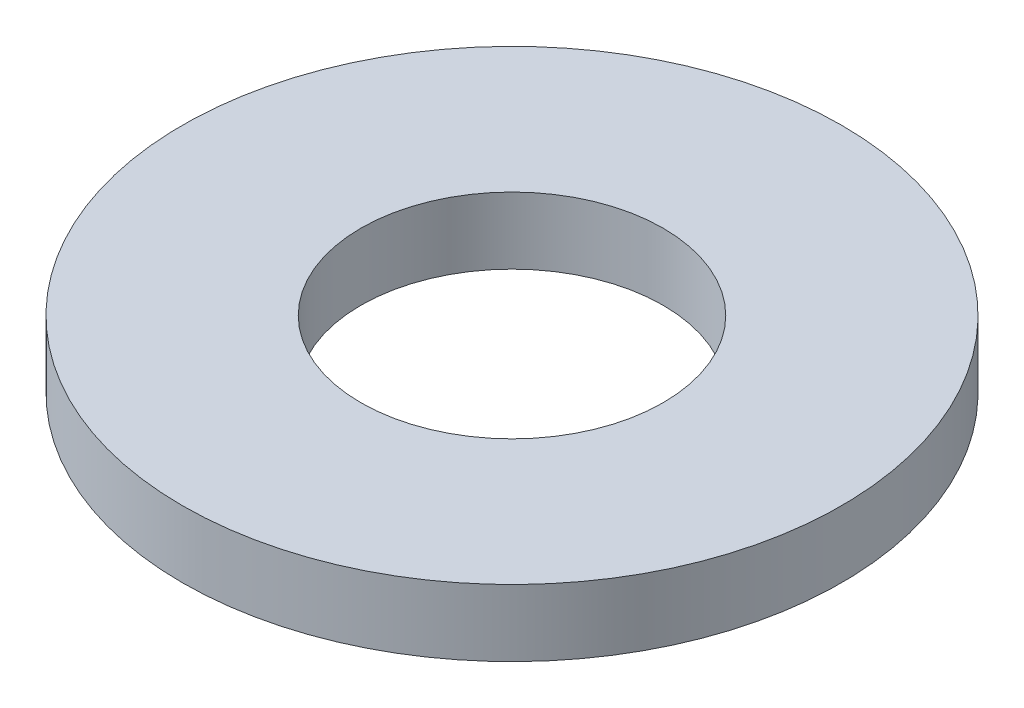
ISO-10303-21;
HEADER;
FILE_DESCRIPTION(('STEP AP214'),'2;1');
FILE_NAME('part.step','',(''),(''),'','','');
FILE_SCHEMA(('AUTOMOTIVE_DESIGN { 1 0 10303 214 1 1 1 1 }'));
ENDSEC;
DATA;
#1=APPLICATION_CONTEXT('core data for automotive mechanical design processes');
#2=APPLICATION_PROTOCOL_DEFINITION('international standard','automotive_design',2000,#1);
#3=PRODUCT_CONTEXT('',#1,'mechanical');
#4=PRODUCT('Part','Part','',(#3));
#5=PRODUCT_RELATED_PRODUCT_CATEGORY('part','',(#4));
#6=PRODUCT_DEFINITION_FORMATION('','',#4);
#7=PRODUCT_DEFINITION_CONTEXT('part definition',#1,'design');
#8=PRODUCT_DEFINITION('design','',#6,#7);
#9=PRODUCT_DEFINITION_SHAPE('','',#8);
#10=(LENGTH_UNIT() NAMED_UNIT(*) SI_UNIT(.MILLI.,.METRE.));
#11=(NAMED_UNIT(*) PLANE_ANGLE_UNIT() SI_UNIT($,.RADIAN.));
#12=(NAMED_UNIT(*) SI_UNIT($,.STERADIAN.) SOLID_ANGLE_UNIT());
#13=UNCERTAINTY_MEASURE_WITH_UNIT(LENGTH_MEASURE(1.E-05),#10,'distance_accuracy_value','');
#14=(GEOMETRIC_REPRESENTATION_CONTEXT(3) GLOBAL_UNCERTAINTY_ASSIGNED_CONTEXT((#13)) GLOBAL_UNIT_ASSIGNED_CONTEXT((#10,
#11,#12)) REPRESENTATION_CONTEXT('',''));
#15=CARTESIAN_POINT('',(0.,0.,0.));
#16=DIRECTION('',(0.,0.,1.));
#17=DIRECTION('',(1.,0.,0.));
#18=AXIS2_PLACEMENT_3D('',#15,#16,#17);
#19=CARTESIAN_POINT('',(0.,0.9652,0.));
#20=DIRECTION('',(0.,-1.,0.));
#21=DIRECTION('',(0.,0.,-1.));
#22=AXIS2_PLACEMENT_3D('',#19,#20,#21);
#23=CYLINDRICAL_SURFACE('',#22,4.7625);
#24=CARTESIAN_POINT('',(0.,0.9652,0.));
#25=DIRECTION('',(0.,1.,0.));
#26=DIRECTION('',(0.,0.,1.));
#27=AXIS2_PLACEMENT_3D('',#24,#25,#26);
#28=CIRCLE('',#27,4.7625);
#29=CARTESIAN_POINT('',(0.,0.9652,-4.7625));
#30=VERTEX_POINT('',#29);
#31=EDGE_CURVE('E10',#30,#30,#28,.T.);
#32=CARTESIAN_POINT('',(0.,0.,0.));
#33=DIRECTION('',(0.,1.,0.));
#34=DIRECTION('',(0.,0.,1.));
#35=AXIS2_PLACEMENT_3D('',#32,#33,#34);
#36=CIRCLE('',#35,4.7625);
#37=CARTESIAN_POINT('',(0.,0.,-4.7625));
#38=VERTEX_POINT('',#37);
#39=EDGE_CURVE('E33',#38,#38,#36,.T.);
#40=CARTESIAN_POINT('',(0.,0.9652,-4.7625));
#41=CARTESIAN_POINT('',(0.,0.955145833333333,-4.7625));
#42=CARTESIAN_POINT('',(0.,0.945091666666667,-4.7625));
#43=CARTESIAN_POINT('',(0.,0.924983333333333,-4.7625));
#44=CARTESIAN_POINT('',(0.,0.914929166666667,-4.7625));
#45=CARTESIAN_POINT('',(0.,0.894820833333333,-4.7625));
#46=CARTESIAN_POINT('',(0.,0.884766666666667,-4.7625));
#47=CARTESIAN_POINT('',(0.,0.864658333333333,-4.7625));
#48=CARTESIAN_POINT('',(0.,0.854604166666667,-4.7625));
#49=CARTESIAN_POINT('',(0.,0.834495833333333,-4.7625));
#50=CARTESIAN_POINT('',(0.,0.824441666666667,-4.7625));
#51=CARTESIAN_POINT('',(0.,0.804333333333333,-4.7625));
#52=CARTESIAN_POINT('',(0.,0.794279166666667,-4.7625));
#53=CARTESIAN_POINT('',(0.,0.774170833333333,-4.7625));
#54=CARTESIAN_POINT('',(0.,0.764116666666667,-4.7625));
#55=CARTESIAN_POINT('',(0.,0.744008333333333,-4.7625));
#56=CARTESIAN_POINT('',(0.,0.733954166666667,-4.7625));
#57=CARTESIAN_POINT('',(0.,0.713845833333333,-4.7625));
#58=CARTESIAN_POINT('',(0.,0.703791666666667,-4.7625));
#59=CARTESIAN_POINT('',(0.,0.683683333333333,-4.7625));
#60=CARTESIAN_POINT('',(0.,0.673629166666667,-4.7625));
#61=CARTESIAN_POINT('',(0.,0.653520833333333,-4.7625));
#62=CARTESIAN_POINT('',(0.,0.643466666666667,-4.7625));
#63=CARTESIAN_POINT('',(0.,0.623358333333333,-4.7625));
#64=CARTESIAN_POINT('',(0.,0.613304166666667,-4.7625));
#65=CARTESIAN_POINT('',(0.,0.593195833333333,-4.7625));
#66=CARTESIAN_POINT('',(0.,0.583141666666667,-4.7625));
#67=CARTESIAN_POINT('',(0.,0.563033333333333,-4.7625));
#68=CARTESIAN_POINT('',(0.,0.552979166666667,-4.7625));
#69=CARTESIAN_POINT('',(0.,0.532870833333333,-4.7625));
#70=CARTESIAN_POINT('',(0.,0.522816666666667,-4.7625));
#71=CARTESIAN_POINT('',(0.,0.502708333333333,-4.7625));
#72=CARTESIAN_POINT('',(0.,0.492654166666667,-4.7625));
#73=CARTESIAN_POINT('',(0.,0.472545833333333,-4.7625));
#74=CARTESIAN_POINT('',(0.,0.462491666666667,-4.7625));
#75=CARTESIAN_POINT('',(0.,0.442383333333333,-4.7625));
#76=CARTESIAN_POINT('',(0.,0.432329166666667,-4.7625));
#77=CARTESIAN_POINT('',(0.,0.412220833333333,-4.7625));
#78=CARTESIAN_POINT('',(0.,0.402166666666667,-4.7625));
#79=CARTESIAN_POINT('',(0.,0.382058333333333,-4.7625));
#80=CARTESIAN_POINT('',(0.,0.372004166666667,-4.7625));
#81=CARTESIAN_POINT('',(0.,0.351895833333333,-4.7625));
#82=CARTESIAN_POINT('',(0.,0.341841666666667,-4.7625));
#83=CARTESIAN_POINT('',(0.,0.321733333333333,-4.7625));
#84=CARTESIAN_POINT('',(0.,0.311679166666667,-4.7625));
#85=CARTESIAN_POINT('',(0.,0.291570833333333,-4.7625));
#86=CARTESIAN_POINT('',(0.,0.281516666666667,-4.7625));
#87=CARTESIAN_POINT('',(0.,0.261408333333333,-4.7625));
#88=CARTESIAN_POINT('',(0.,0.251354166666667,-4.7625));
#89=CARTESIAN_POINT('',(0.,0.231245833333333,-4.7625));
#90=CARTESIAN_POINT('',(0.,0.221191666666667,-4.7625));
#91=CARTESIAN_POINT('',(0.,0.201083333333333,-4.7625));
#92=CARTESIAN_POINT('',(0.,0.191029166666667,-4.7625));
#93=CARTESIAN_POINT('',(0.,0.170920833333333,-4.7625));
#94=CARTESIAN_POINT('',(0.,0.160866666666667,-4.7625));
#95=CARTESIAN_POINT('',(0.,0.140758333333333,-4.7625));
#96=CARTESIAN_POINT('',(0.,0.130704166666667,-4.7625));
#97=CARTESIAN_POINT('',(0.,0.110595833333333,-4.7625));
#98=CARTESIAN_POINT('',(0.,0.100541666666667,-4.7625));
#99=CARTESIAN_POINT('',(0.,0.0804333333333333,-4.7625));
#100=CARTESIAN_POINT('',(0.,0.0703791666666666,-4.7625));
#101=CARTESIAN_POINT('',(0.,0.0502708333333333,-4.7625));
#102=CARTESIAN_POINT('',(0.,0.0402166666666666,-4.7625));
#103=CARTESIAN_POINT('',(0.,0.0201083333333333,-4.7625));
#104=CARTESIAN_POINT('',(0.,0.0100541666666667,-4.7625));
#105=CARTESIAN_POINT('',(0.,0.,-4.7625));
#106=B_SPLINE_CURVE_WITH_KNOTS('',3,(#40,#41,#42,#43,#44,#45,#46,#47,#48,#49,#50,#51,#52,#53,
#54,#55,#56,#57,#58,#59,#60,#61,#62,#63,#64,#65,#66,#67,#68,#69,#70,#71,#72,#73,#74,#75,#76,#77,
#78,#79,#80,#81,#82,#83,#84,#85,#86,#87,#88,#89,#90,#91,#92,#93,#94,#95,#96,#97,#98,#99,#100,
#101,#102,#103,#104,#105),.UNSPECIFIED.,.F.,.F.,(4,2,2,2,2,2,2,2,2,2,2,2,2,2,2,2,2,2,2,2,2,2,2,
2,2,2,2,2,2,2,2,2,4),(0.,0.0301625,0.060325,0.0904874999999999,0.12065,0.1508125,0.180975,
0.2111375,0.2413,0.2714625,0.301625,0.3317875,0.36195,0.3921125,0.422275,0.4524375,0.4826,
0.5127625,0.542925,0.5730875,0.60325,0.6334125,0.663575,0.6937375,0.7239,0.7540625,0.784225,
0.8143875,0.84455,0.8747125,0.904875,0.9350375,0.9652),.UNSPECIFIED.);
#107=EDGE_CURVE('BSEAM30',#30,#38,#106,.T.);
#108=ORIENTED_EDGE('',*,*,#31,.F.);
#109=ORIENTED_EDGE('',*,*,#39,.T.);
#110=ORIENTED_EDGE('',*,*,#107,.T.);
#111=ORIENTED_EDGE('',*,*,#107,.F.);
#112=EDGE_LOOP('',(#108,#110,#109,#111));
#113=FACE_BOUND('',#112,.T.);
#114=ADVANCED_FACE('F30',(#113),#23,.T.);
#115=CARTESIAN_POINT('',(0.,0.9652,0.));
#116=DIRECTION('',(0.,1.,0.));
#117=DIRECTION('',(0.,0.,1.));
#118=AXIS2_PLACEMENT_3D('',#115,#116,#117);
#119=PLANE('',#118);
#120=CARTESIAN_POINT('',(0.,0.9652,0.));
#121=DIRECTION('',(0.,1.,0.));
#122=DIRECTION('',(0.,0.,1.));
#123=AXIS2_PLACEMENT_3D('',#120,#121,#122);
#124=CIRCLE('',#123,2.1844);
#125=CARTESIAN_POINT('',(0.,0.9652,2.1844));
#126=VERTEX_POINT('',#125);
#127=EDGE_CURVE('E42',#126,#126,#124,.T.);
#128=ORIENTED_EDGE('',*,*,#127,.F.);
#129=EDGE_LOOP('',(#128));
#130=FACE_BOUND('',#129,.T.);
#131=ORIENTED_EDGE('',*,*,#31,.T.);
#132=EDGE_LOOP('',(#131));
#133=FACE_BOUND('',#132,.T.);
#134=ADVANCED_FACE('F57',(#130,#133),#119,.T.);
#135=CARTESIAN_POINT('',(0.,0.,0.));
#136=DIRECTION('',(0.,1.,0.));
#137=DIRECTION('',(0.,0.,1.));
#138=AXIS2_PLACEMENT_3D('',#135,#136,#137);
#139=PLANE('',#138);
#140=CARTESIAN_POINT('',(0.,0.,0.));
#141=DIRECTION('',(0.,1.,0.));
#142=DIRECTION('',(0.,0.,1.));
#143=AXIS2_PLACEMENT_3D('',#140,#141,#142);
#144=CIRCLE('',#143,2.1844);
#145=CARTESIAN_POINT('',(0.,0.,2.1844));
#146=VERTEX_POINT('',#145);
#147=EDGE_CURVE('E40',#146,#146,#144,.T.);
#148=ORIENTED_EDGE('',*,*,#147,.T.);
#149=EDGE_LOOP('',(#148));
#150=FACE_BOUND('',#149,.T.);
#151=ORIENTED_EDGE('',*,*,#39,.F.);
#152=EDGE_LOOP('',(#151));
#153=FACE_BOUND('',#152,.T.);
#154=ADVANCED_FACE('F48',(#150,#153),#139,.F.);
#155=CARTESIAN_POINT('',(0.,0.,0.));
#156=DIRECTION('',(0.,1.,0.));
#157=DIRECTION('',(0.,0.,1.));
#158=AXIS2_PLACEMENT_3D('',#155,#156,#157);
#159=CYLINDRICAL_SURFACE('',#158,2.1844);
#160=CARTESIAN_POINT('',(0.,0.,2.1844));
#161=CARTESIAN_POINT('',(0.,0.0100541666666667,2.1844));
#162=CARTESIAN_POINT('',(0.,0.0201083333333333,2.1844));
#163=CARTESIAN_POINT('',(0.,0.0402166666666667,2.1844));
#164=CARTESIAN_POINT('',(0.,0.0502708333333333,2.1844));
#165=CARTESIAN_POINT('',(0.,0.0703791666666667,2.1844));
#166=CARTESIAN_POINT('',(0.,0.0804333333333333,2.1844));
#167=CARTESIAN_POINT('',(0.,0.100541666666667,2.1844));
#168=CARTESIAN_POINT('',(0.,0.110595833333333,2.1844));
#169=CARTESIAN_POINT('',(0.,0.130704166666667,2.1844));
#170=CARTESIAN_POINT('',(0.,0.140758333333333,2.1844));
#171=CARTESIAN_POINT('',(0.,0.160866666666667,2.1844));
#172=CARTESIAN_POINT('',(0.,0.170920833333333,2.1844));
#173=CARTESIAN_POINT('',(0.,0.191029166666667,2.1844));
#174=CARTESIAN_POINT('',(0.,0.201083333333333,2.1844));
#175=CARTESIAN_POINT('',(0.,0.221191666666667,2.1844));
#176=CARTESIAN_POINT('',(0.,0.231245833333333,2.1844));
#177=CARTESIAN_POINT('',(0.,0.251354166666667,2.1844));
#178=CARTESIAN_POINT('',(0.,0.261408333333333,2.1844));
#179=CARTESIAN_POINT('',(0.,0.281516666666667,2.1844));
#180=CARTESIAN_POINT('',(0.,0.291570833333333,2.1844));
#181=CARTESIAN_POINT('',(0.,0.311679166666667,2.1844));
#182=CARTESIAN_POINT('',(0.,0.321733333333333,2.1844));
#183=CARTESIAN_POINT('',(0.,0.341841666666667,2.1844));
#184=CARTESIAN_POINT('',(0.,0.351895833333333,2.1844));
#185=CARTESIAN_POINT('',(0.,0.372004166666667,2.1844));
#186=CARTESIAN_POINT('',(0.,0.382058333333333,2.1844));
#187=CARTESIAN_POINT('',(0.,0.402166666666667,2.1844));
#188=CARTESIAN_POINT('',(0.,0.412220833333333,2.1844));
#189=CARTESIAN_POINT('',(0.,0.432329166666667,2.1844));
#190=CARTESIAN_POINT('',(0.,0.442383333333333,2.1844));
#191=CARTESIAN_POINT('',(0.,0.462491666666667,2.1844));
#192=CARTESIAN_POINT('',(0.,0.472545833333333,2.1844));
#193=CARTESIAN_POINT('',(0.,0.492654166666667,2.1844));
#194=CARTESIAN_POINT('',(0.,0.502708333333333,2.1844));
#195=CARTESIAN_POINT('',(0.,0.522816666666667,2.1844));
#196=CARTESIAN_POINT('',(0.,0.532870833333333,2.1844));
#197=CARTESIAN_POINT('',(0.,0.552979166666667,2.1844));
#198=CARTESIAN_POINT('',(0.,0.563033333333333,2.1844));
#199=CARTESIAN_POINT('',(0.,0.583141666666667,2.1844));
#200=CARTESIAN_POINT('',(0.,0.593195833333333,2.1844));
#201=CARTESIAN_POINT('',(0.,0.613304166666667,2.1844));
#202=CARTESIAN_POINT('',(0.,0.623358333333333,2.1844));
#203=CARTESIAN_POINT('',(0.,0.643466666666667,2.1844));
#204=CARTESIAN_POINT('',(0.,0.653520833333333,2.1844));
#205=CARTESIAN_POINT('',(0.,0.673629166666667,2.1844));
#206=CARTESIAN_POINT('',(0.,0.683683333333333,2.1844));
#207=CARTESIAN_POINT('',(0.,0.703791666666667,2.1844));
#208=CARTESIAN_POINT('',(0.,0.713845833333333,2.1844));
#209=CARTESIAN_POINT('',(0.,0.733954166666667,2.1844));
#210=CARTESIAN_POINT('',(0.,0.744008333333333,2.1844));
#211=CARTESIAN_POINT('',(0.,0.764116666666667,2.1844));
#212=CARTESIAN_POINT('',(0.,0.774170833333333,2.1844));
#213=CARTESIAN_POINT('',(0.,0.794279166666667,2.1844));
#214=CARTESIAN_POINT('',(0.,0.804333333333333,2.1844));
#215=CARTESIAN_POINT('',(0.,0.824441666666667,2.1844));
#216=CARTESIAN_POINT('',(0.,0.834495833333333,2.1844));
#217=CARTESIAN_POINT('',(0.,0.854604166666667,2.1844));
#218=CARTESIAN_POINT('',(0.,0.864658333333333,2.1844));
#219=CARTESIAN_POINT('',(0.,0.884766666666667,2.1844));
#220=CARTESIAN_POINT('',(0.,0.894820833333333,2.1844));
#221=CARTESIAN_POINT('',(0.,0.914929166666667,2.1844));
#222=CARTESIAN_POINT('',(0.,0.924983333333333,2.1844));
#223=CARTESIAN_POINT('',(0.,0.945091666666667,2.1844));
#224=CARTESIAN_POINT('',(0.,0.955145833333333,2.1844));
#225=CARTESIAN_POINT('',(0.,0.9652,2.1844));
#226=B_SPLINE_CURVE_WITH_KNOTS('',3,(#160,#161,#162,#163,#164,#165,#166,#167,#168,#169,#170,
#171,#172,#173,#174,#175,#176,#177,#178,#179,#180,#181,#182,#183,#184,#185,#186,#187,#188,#189,
#190,#191,#192,#193,#194,#195,#196,#197,#198,#199,#200,#201,#202,#203,#204,#205,#206,#207,#208,
#209,#210,#211,#212,#213,#214,#215,#216,#217,#218,#219,#220,#221,#222,#223,#224,#225),
.UNSPECIFIED.,.F.,.F.,(4,2,2,2,2,2,2,2,2,2,2,2,2,2,2,2,2,2,2,2,2,2,2,2,2,2,2,2,2,2,2,2,4),(0.,
0.0301625,0.060325,0.0904875,0.12065,0.1508125,0.180975,0.2111375,0.2413,0.2714625,0.301625,
0.3317875,0.36195,0.3921125,0.422275,0.4524375,0.4826,0.5127625,0.542925,0.5730875,0.60325,
0.6334125,0.663575,0.6937375,0.7239,0.7540625,0.784225,0.8143875,0.84455,0.8747125,0.904875,
0.9350375,0.9652),.UNSPECIFIED.);
#227=EDGE_CURVE('BSEAM51',#146,#126,#226,.T.);
#228=ORIENTED_EDGE('',*,*,#147,.F.);
#229=ORIENTED_EDGE('',*,*,#127,.T.);
#230=ORIENTED_EDGE('',*,*,#227,.T.);
#231=ORIENTED_EDGE('',*,*,#227,.F.);
#232=EDGE_LOOP('',(#228,#230,#229,#231));
#233=FACE_BOUND('',#232,.T.);
#234=ADVANCED_FACE('F51',(#233),#159,.F.);
#235=CLOSED_SHELL('',(#114,#134,#154,#234));
#236=MANIFOLD_SOLID_BREP('B2',#235);
#237=ADVANCED_BREP_SHAPE_REPRESENTATION('',(#18,#236),#14);
#238=SHAPE_DEFINITION_REPRESENTATION(#9,#237);
ENDSEC;
END-ISO-10303-21;
